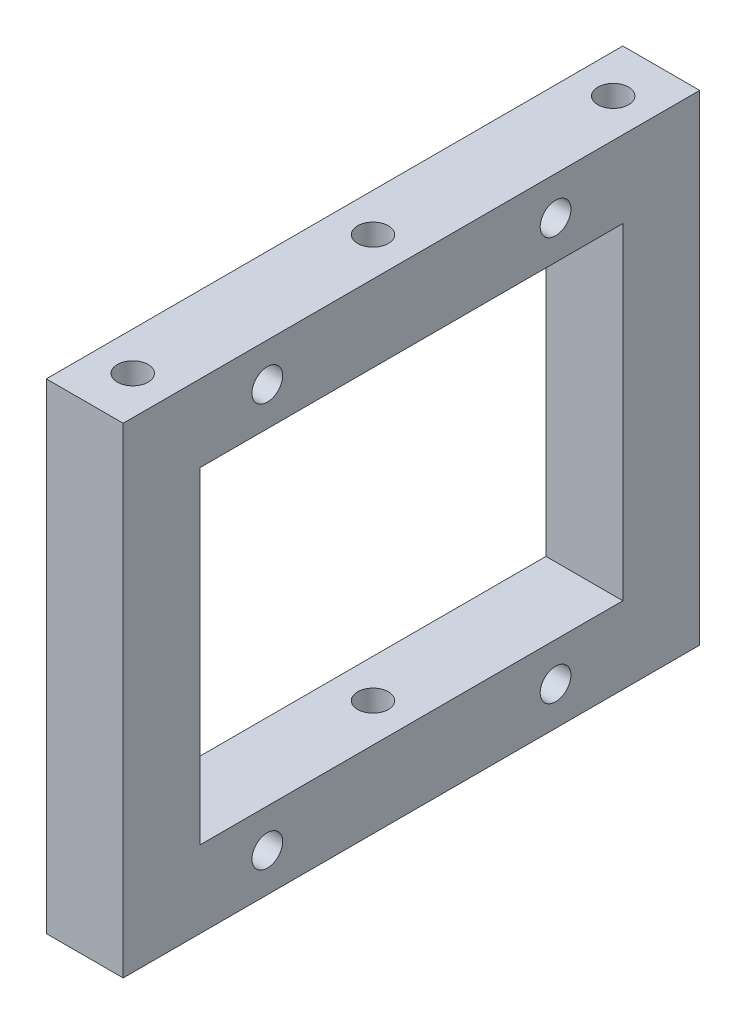
ISO-10303-21;
HEADER;
FILE_DESCRIPTION(('STEP AP214'),'2;1');
FILE_NAME('part.step','',(''),(''),'','','');
FILE_SCHEMA(('AUTOMOTIVE_DESIGN { 1 0 10303 214 1 1 1 1 }'));
ENDSEC;
DATA;
#1=APPLICATION_CONTEXT('core data for automotive mechanical design processes');
#2=APPLICATION_PROTOCOL_DEFINITION('international standard','automotive_design',2000,#1);
#3=PRODUCT_CONTEXT('',#1,'mechanical');
#4=PRODUCT('Part','Part','',(#3));
#5=PRODUCT_RELATED_PRODUCT_CATEGORY('part','',(#4));
#6=PRODUCT_DEFINITION_FORMATION('','',#4);
#7=PRODUCT_DEFINITION_CONTEXT('part definition',#1,'design');
#8=PRODUCT_DEFINITION('design','',#6,#7);
#9=PRODUCT_DEFINITION_SHAPE('','',#8);
#10=(LENGTH_UNIT() NAMED_UNIT(*) SI_UNIT(.MILLI.,.METRE.));
#11=(NAMED_UNIT(*) PLANE_ANGLE_UNIT() SI_UNIT($,.RADIAN.));
#12=(NAMED_UNIT(*) SI_UNIT($,.STERADIAN.) SOLID_ANGLE_UNIT());
#13=UNCERTAINTY_MEASURE_WITH_UNIT(LENGTH_MEASURE(1.E-05),#10,'distance_accuracy_value','');
#14=(GEOMETRIC_REPRESENTATION_CONTEXT(3) GLOBAL_UNCERTAINTY_ASSIGNED_CONTEXT((#13)) GLOBAL_UNIT_ASSIGNED_CONTEXT((#10,
#11,#12)) REPRESENTATION_CONTEXT('',''));
#15=CARTESIAN_POINT('',(0.,0.,0.));
#16=DIRECTION('',(0.,0.,1.));
#17=DIRECTION('',(1.,0.,0.));
#18=AXIS2_PLACEMENT_3D('',#15,#16,#17);
#19=CARTESIAN_POINT('',(8.,0.,0.));
#20=DIRECTION('',(-1.,0.,0.));
#21=DIRECTION('',(0.,0.,1.));
#22=AXIS2_PLACEMENT_3D('',#19,#20,#21);
#23=PLANE('',#22);
#24=CARTESIAN_POINT('',(8.,4.,-15.));
#25=DIRECTION('',(1.,0.,0.));
#26=DIRECTION('',(0.,0.,-1.));
#27=AXIS2_PLACEMENT_3D('',#24,#25,#26);
#28=CIRCLE('',#27,1.6);
#29=CARTESIAN_POINT('',(8.,4.,-16.6));
#30=VERTEX_POINT('',#29);
#31=EDGE_CURVE('E146',#30,#30,#28,.T.);
#32=ORIENTED_EDGE('',*,*,#31,.F.);
#33=EDGE_LOOP('',(#32));
#34=FACE_BOUND('',#33,.T.);
#35=CARTESIAN_POINT('',(8.,46.,-45.));
#36=DIRECTION('',(1.,0.,0.));
#37=DIRECTION('',(0.,0.,-1.));
#38=AXIS2_PLACEMENT_3D('',#35,#36,#37);
#39=CIRCLE('',#38,1.6);
#40=CARTESIAN_POINT('',(8.,46.,-46.6));
#41=VERTEX_POINT('',#40);
#42=EDGE_CURVE('E152',#41,#41,#39,.T.);
#43=ORIENTED_EDGE('',*,*,#42,.F.);
#44=EDGE_LOOP('',(#43));
#45=FACE_BOUND('',#44,.T.);
#46=CARTESIAN_POINT('',(8.,46.,-15.));
#47=DIRECTION('',(1.,0.,0.));
#48=DIRECTION('',(0.,0.,-1.));
#49=AXIS2_PLACEMENT_3D('',#46,#47,#48);
#50=CIRCLE('',#49,1.6);
#51=CARTESIAN_POINT('',(8.,46.,-16.6));
#52=VERTEX_POINT('',#51);
#53=EDGE_CURVE('E158',#52,#52,#50,.T.);
#54=ORIENTED_EDGE('',*,*,#53,.F.);
#55=EDGE_LOOP('',(#54));
#56=FACE_BOUND('',#55,.T.);
#57=DIRECTION('',(0.,-1.,0.));
#58=VECTOR('',#57,1.);
#59=CARTESIAN_POINT('',(8.,0.,0.));
#60=LINE('',#59,#58);
#61=CARTESIAN_POINT('',(8.,50.,0.));
#62=VERTEX_POINT('',#61);
#63=CARTESIAN_POINT('',(8.,0.,0.));
#64=VERTEX_POINT('',#63);
#65=EDGE_CURVE('E164',#62,#64,#60,.T.);
#66=ORIENTED_EDGE('',*,*,#65,.T.);
#67=DIRECTION('',(0.,0.,-1.));
#68=VECTOR('',#67,1.);
#69=CARTESIAN_POINT('',(8.,0.,0.));
#70=LINE('',#69,#68);
#71=CARTESIAN_POINT('',(8.,0.,-60.));
#72=VERTEX_POINT('',#71);
#73=EDGE_CURVE('E167',#64,#72,#70,.T.);
#74=ORIENTED_EDGE('',*,*,#73,.T.);
#75=DIRECTION('',(0.,1.,0.));
#76=VECTOR('',#75,1.);
#77=CARTESIAN_POINT('',(8.,0.,-60.));
#78=LINE('',#77,#76);
#79=CARTESIAN_POINT('',(8.,50.,-60.));
#80=VERTEX_POINT('',#79);
#81=EDGE_CURVE('E170',#72,#80,#78,.T.);
#82=ORIENTED_EDGE('',*,*,#81,.T.);
#83=DIRECTION('',(0.,0.,1.));
#84=VECTOR('',#83,1.);
#85=CARTESIAN_POINT('',(8.,50.,0.));
#86=LINE('',#85,#84);
#87=EDGE_CURVE('E172',#80,#62,#86,.T.);
#88=ORIENTED_EDGE('',*,*,#87,.T.);
#89=EDGE_LOOP('',(#66,#74,#82,#88));
#90=FACE_BOUND('',#89,.T.);
#91=DIRECTION('',(0.,-1.,0.));
#92=VECTOR('',#91,1.);
#93=CARTESIAN_POINT('',(8.,42.,-8.));
#94=LINE('',#93,#92);
#95=CARTESIAN_POINT('',(8.,42.,-8.));
#96=VERTEX_POINT('',#95);
#97=CARTESIAN_POINT('',(8.,8.00000000000001,-8.));
#98=VERTEX_POINT('',#97);
#99=EDGE_CURVE('E107',#96,#98,#94,.T.);
#100=ORIENTED_EDGE('',*,*,#99,.F.);
#101=DIRECTION('',(0.,0.,1.));
#102=VECTOR('',#101,1.);
#103=CARTESIAN_POINT('',(8.,42.,-8.));
#104=LINE('',#103,#102);
#105=CARTESIAN_POINT('',(8.,42.,-52.));
#106=VERTEX_POINT('',#105);
#107=EDGE_CURVE('E130',#106,#96,#104,.T.);
#108=ORIENTED_EDGE('',*,*,#107,.F.);
#109=DIRECTION('',(0.,1.,0.));
#110=VECTOR('',#109,1.);
#111=CARTESIAN_POINT('',(8.,42.,-52.));
#112=LINE('',#111,#110);
#113=CARTESIAN_POINT('',(8.,8.00000000000001,-52.));
#114=VERTEX_POINT('',#113);
#115=EDGE_CURVE('E128',#114,#106,#112,.T.);
#116=ORIENTED_EDGE('',*,*,#115,.F.);
#117=DIRECTION('',(0.,0.,-1.));
#118=VECTOR('',#117,1.);
#119=CARTESIAN_POINT('',(8.,8.00000000000001,-8.));
#120=LINE('',#119,#118);
#121=EDGE_CURVE('E115',#98,#114,#120,.T.);
#122=ORIENTED_EDGE('',*,*,#121,.F.);
#123=EDGE_LOOP('',(#100,#108,#116,#122));
#124=FACE_BOUND('',#123,.T.);
#125=CARTESIAN_POINT('',(8.,4.,-45.));
#126=DIRECTION('',(1.,0.,0.));
#127=DIRECTION('',(0.,0.,-1.));
#128=AXIS2_PLACEMENT_3D('',#125,#126,#127);
#129=CIRCLE('',#128,1.6);
#130=CARTESIAN_POINT('',(8.,4.,-46.6));
#131=VERTEX_POINT('',#130);
#132=EDGE_CURVE('E136',#131,#131,#129,.T.);
#133=ORIENTED_EDGE('',*,*,#132,.F.);
#134=EDGE_LOOP('',(#133));
#135=FACE_BOUND('',#134,.T.);
#136=ADVANCED_FACE('F40',(#34,#45,#56,#90,#124,#135),#23,.F.);
#137=CARTESIAN_POINT('',(0.,0.,0.));
#138=DIRECTION('',(-1.,0.,0.));
#139=DIRECTION('',(0.,0.,1.));
#140=AXIS2_PLACEMENT_3D('',#137,#138,#139);
#141=PLANE('',#140);
#142=DIRECTION('',(0.,0.,1.));
#143=VECTOR('',#142,1.);
#144=CARTESIAN_POINT('',(0.,42.,-8.));
#145=LINE('',#144,#143);
#146=CARTESIAN_POINT('',(0.,42.,-52.));
#147=VERTEX_POINT('',#146);
#148=CARTESIAN_POINT('',(0.,42.,-8.));
#149=VERTEX_POINT('',#148);
#150=EDGE_CURVE('E116',#147,#149,#145,.T.);
#151=ORIENTED_EDGE('',*,*,#150,.T.);
#152=DIRECTION('',(0.,-1.,0.));
#153=VECTOR('',#152,1.);
#154=CARTESIAN_POINT('',(0.,42.,-8.));
#155=LINE('',#154,#153);
#156=CARTESIAN_POINT('',(0.,8.00000000000001,-8.));
#157=VERTEX_POINT('',#156);
#158=EDGE_CURVE('E65',#149,#157,#155,.T.);
#159=ORIENTED_EDGE('',*,*,#158,.T.);
#160=DIRECTION('',(0.,0.,-1.));
#161=VECTOR('',#160,1.);
#162=CARTESIAN_POINT('',(0.,8.00000000000001,-8.));
#163=LINE('',#162,#161);
#164=CARTESIAN_POINT('',(0.,8.00000000000001,-52.));
#165=VERTEX_POINT('',#164);
#166=EDGE_CURVE('E122',#157,#165,#163,.T.);
#167=ORIENTED_EDGE('',*,*,#166,.T.);
#168=DIRECTION('',(0.,1.,0.));
#169=VECTOR('',#168,1.);
#170=CARTESIAN_POINT('',(0.,42.,-52.));
#171=LINE('',#170,#169);
#172=EDGE_CURVE('E138',#165,#147,#171,.T.);
#173=ORIENTED_EDGE('',*,*,#172,.T.);
#174=EDGE_LOOP('',(#151,#159,#167,#173));
#175=FACE_BOUND('',#174,.T.);
#176=CARTESIAN_POINT('',(0.,4.,-15.));
#177=DIRECTION('',(1.,0.,0.));
#178=DIRECTION('',(0.,0.,-1.));
#179=AXIS2_PLACEMENT_3D('',#176,#177,#178);
#180=CIRCLE('',#179,1.6);
#181=CARTESIAN_POINT('',(0.,4.,-16.6));
#182=VERTEX_POINT('',#181);
#183=EDGE_CURVE('E123',#182,#182,#180,.T.);
#184=ORIENTED_EDGE('',*,*,#183,.T.);
#185=EDGE_LOOP('',(#184));
#186=FACE_BOUND('',#185,.T.);
#187=CARTESIAN_POINT('',(0.,46.,-15.));
#188=DIRECTION('',(1.,0.,0.));
#189=DIRECTION('',(0.,0.,-1.));
#190=AXIS2_PLACEMENT_3D('',#187,#188,#189);
#191=CIRCLE('',#190,1.6);
#192=CARTESIAN_POINT('',(0.,46.,-16.6));
#193=VERTEX_POINT('',#192);
#194=EDGE_CURVE('E155',#193,#193,#191,.T.);
#195=ORIENTED_EDGE('',*,*,#194,.T.);
#196=EDGE_LOOP('',(#195));
#197=FACE_BOUND('',#196,.T.);
#198=DIRECTION('',(0.,-1.,0.));
#199=VECTOR('',#198,1.);
#200=CARTESIAN_POINT('',(0.,0.,0.));
#201=LINE('',#200,#199);
#202=CARTESIAN_POINT('',(0.,50.,0.));
#203=VERTEX_POINT('',#202);
#204=CARTESIAN_POINT('',(0.,0.,0.));
#205=VERTEX_POINT('',#204);
#206=EDGE_CURVE('E161',#203,#205,#201,.T.);
#207=ORIENTED_EDGE('',*,*,#206,.F.);
#208=DIRECTION('',(0.,0.,1.));
#209=VECTOR('',#208,1.);
#210=CARTESIAN_POINT('',(0.,50.,0.));
#211=LINE('',#210,#209);
#212=CARTESIAN_POINT('',(0.,50.,-60.));
#213=VERTEX_POINT('',#212);
#214=EDGE_CURVE('E168',#213,#203,#211,.T.);
#215=ORIENTED_EDGE('',*,*,#214,.F.);
#216=DIRECTION('',(0.,1.,0.));
#217=VECTOR('',#216,1.);
#218=CARTESIAN_POINT('',(0.,0.,-60.));
#219=LINE('',#218,#217);
#220=CARTESIAN_POINT('',(0.,0.,-60.));
#221=VERTEX_POINT('',#220);
#222=EDGE_CURVE('E179',#221,#213,#219,.T.);
#223=ORIENTED_EDGE('',*,*,#222,.F.);
#224=DIRECTION('',(0.,0.,-1.));
#225=VECTOR('',#224,1.);
#226=CARTESIAN_POINT('',(0.,0.,0.));
#227=LINE('',#226,#225);
#228=EDGE_CURVE('E177',#205,#221,#227,.T.);
#229=ORIENTED_EDGE('',*,*,#228,.F.);
#230=EDGE_LOOP('',(#207,#215,#223,#229));
#231=FACE_BOUND('',#230,.T.);
#232=CARTESIAN_POINT('',(0.,46.,-45.));
#233=DIRECTION('',(1.,0.,0.));
#234=DIRECTION('',(0.,0.,-1.));
#235=AXIS2_PLACEMENT_3D('',#232,#233,#234);
#236=CIRCLE('',#235,1.6);
#237=CARTESIAN_POINT('',(0.,46.,-46.6));
#238=VERTEX_POINT('',#237);
#239=EDGE_CURVE('E149',#238,#238,#236,.T.);
#240=ORIENTED_EDGE('',*,*,#239,.T.);
#241=EDGE_LOOP('',(#240));
#242=FACE_BOUND('',#241,.T.);
#243=CARTESIAN_POINT('',(0.,4.,-45.));
#244=DIRECTION('',(1.,0.,0.));
#245=DIRECTION('',(0.,0.,-1.));
#246=AXIS2_PLACEMENT_3D('',#243,#244,#245);
#247=CIRCLE('',#246,1.6);
#248=CARTESIAN_POINT('',(0.,4.,-46.6));
#249=VERTEX_POINT('',#248);
#250=EDGE_CURVE('E190',#249,#249,#247,.T.);
#251=ORIENTED_EDGE('',*,*,#250,.T.);
#252=EDGE_LOOP('',(#251));
#253=FACE_BOUND('',#252,.T.);
#254=ADVANCED_FACE('F221',(#175,#186,#197,#231,#242,#253),#141,.T.);
#255=CARTESIAN_POINT('',(8.,0.,0.));
#256=DIRECTION('',(0.,0.,-1.));
#257=DIRECTION('',(-1.,0.,0.));
#258=AXIS2_PLACEMENT_3D('',#255,#256,#257);
#259=PLANE('',#258);
#260=ORIENTED_EDGE('',*,*,#206,.T.);
#261=DIRECTION('',(-1.,0.,0.));
#262=VECTOR('',#261,1.);
#263=CARTESIAN_POINT('',(8.,0.,0.));
#264=LINE('',#263,#262);
#265=EDGE_CURVE('E11',#64,#205,#264,.T.);
#266=ORIENTED_EDGE('',*,*,#265,.F.);
#267=ORIENTED_EDGE('',*,*,#65,.F.);
#268=DIRECTION('',(-1.,0.,0.));
#269=VECTOR('',#268,1.);
#270=CARTESIAN_POINT('',(8.,50.,0.));
#271=LINE('',#270,#269);
#272=EDGE_CURVE('E174',#62,#203,#271,.T.);
#273=ORIENTED_EDGE('',*,*,#272,.T.);
#274=EDGE_LOOP('',(#260,#266,#267,#273));
#275=FACE_BOUND('',#274,.T.);
#276=ADVANCED_FACE('F42',(#275),#259,.F.);
#277=CARTESIAN_POINT('',(8.,0.,0.));
#278=DIRECTION('',(0.,1.,0.));
#279=DIRECTION('',(0.,0.,1.));
#280=AXIS2_PLACEMENT_3D('',#277,#278,#279);
#281=PLANE('',#280);
#282=CARTESIAN_POINT('',(4.,0.,-5.));
#283=DIRECTION('',(0.,-1.,0.));
#284=DIRECTION('',(0.,0.,-1.));
#285=AXIS2_PLACEMENT_3D('',#282,#283,#284);
#286=CIRCLE('',#285,1.6);
#287=CARTESIAN_POINT('',(4.,0.,-6.6));
#288=VERTEX_POINT('',#287);
#289=EDGE_CURVE('E196',#288,#288,#286,.T.);
#290=ORIENTED_EDGE('',*,*,#289,.F.);
#291=EDGE_LOOP('',(#290));
#292=FACE_BOUND('',#291,.T.);
#293=CARTESIAN_POINT('',(4.,0.,-30.));
#294=DIRECTION('',(0.,-1.,0.));
#295=DIRECTION('',(0.,0.,-1.));
#296=AXIS2_PLACEMENT_3D('',#293,#294,#295);
#297=CIRCLE('',#296,1.6);
#298=CARTESIAN_POINT('',(4.,0.,-31.6));
#299=VERTEX_POINT('',#298);
#300=EDGE_CURVE('E201',#299,#299,#297,.T.);
#301=ORIENTED_EDGE('',*,*,#300,.F.);
#302=EDGE_LOOP('',(#301));
#303=FACE_BOUND('',#302,.T.);
#304=CARTESIAN_POINT('',(4.00000000000001,0.,-55.));
#305=DIRECTION('',(0.,-1.,0.));
#306=DIRECTION('',(0.,0.,-1.));
#307=AXIS2_PLACEMENT_3D('',#304,#305,#306);
#308=CIRCLE('',#307,1.6);
#309=CARTESIAN_POINT('',(4.00000000000001,0.,-56.6));
#310=VERTEX_POINT('',#309);
#311=EDGE_CURVE('E212',#310,#310,#308,.T.);
#312=ORIENTED_EDGE('',*,*,#311,.F.);
#313=EDGE_LOOP('',(#312));
#314=FACE_BOUND('',#313,.T.);
#315=ORIENTED_EDGE('',*,*,#228,.T.);
#316=DIRECTION('',(-1.,0.,0.));
#317=VECTOR('',#316,1.);
#318=CARTESIAN_POINT('',(8.,0.,-60.));
#319=LINE('',#318,#317);
#320=EDGE_CURVE('E49',#72,#221,#319,.T.);
#321=ORIENTED_EDGE('',*,*,#320,.F.);
#322=ORIENTED_EDGE('',*,*,#73,.F.);
#323=ORIENTED_EDGE('',*,*,#265,.T.);
#324=EDGE_LOOP('',(#315,#321,#322,#323));
#325=FACE_BOUND('',#324,.T.);
#326=ADVANCED_FACE('F241',(#292,#303,#314,#325),#281,.F.);
#327=CARTESIAN_POINT('',(8.,0.,-60.));
#328=DIRECTION('',(0.,0.,1.));
#329=DIRECTION('',(1.,0.,0.));
#330=AXIS2_PLACEMENT_3D('',#327,#328,#329);
#331=PLANE('',#330);
#332=ORIENTED_EDGE('',*,*,#222,.T.);
#333=DIRECTION('',(-1.,0.,0.));
#334=VECTOR('',#333,1.);
#335=CARTESIAN_POINT('',(8.,50.,-60.));
#336=LINE('',#335,#334);
#337=EDGE_CURVE('E184',#80,#213,#336,.T.);
#338=ORIENTED_EDGE('',*,*,#337,.F.);
#339=ORIENTED_EDGE('',*,*,#81,.F.);
#340=ORIENTED_EDGE('',*,*,#320,.T.);
#341=EDGE_LOOP('',(#332,#338,#339,#340));
#342=FACE_BOUND('',#341,.T.);
#343=ADVANCED_FACE('F238',(#342),#331,.F.);
#344=CARTESIAN_POINT('',(8.,50.,0.));
#345=DIRECTION('',(0.,-1.,0.));
#346=DIRECTION('',(0.,0.,-1.));
#347=AXIS2_PLACEMENT_3D('',#344,#345,#346);
#348=PLANE('',#347);
#349=CARTESIAN_POINT('',(4.,50.,-5.));
#350=DIRECTION('',(0.,-1.,0.));
#351=DIRECTION('',(0.,0.,-1.));
#352=AXIS2_PLACEMENT_3D('',#349,#350,#351);
#353=CIRCLE('',#352,1.6);
#354=CARTESIAN_POINT('',(4.,50.,-6.6));
#355=VERTEX_POINT('',#354);
#356=EDGE_CURVE('E557',#355,#355,#353,.T.);
#357=ORIENTED_EDGE('',*,*,#356,.T.);
#358=EDGE_LOOP('',(#357));
#359=FACE_BOUND('',#358,.T.);
#360=CARTESIAN_POINT('',(4.,50.,-30.));
#361=DIRECTION('',(0.,-1.,0.));
#362=DIRECTION('',(0.,0.,-1.));
#363=AXIS2_PLACEMENT_3D('',#360,#361,#362);
#364=CIRCLE('',#363,1.6);
#365=CARTESIAN_POINT('',(4.,50.,-31.6));
#366=VERTEX_POINT('',#365);
#367=EDGE_CURVE('E561',#366,#366,#364,.T.);
#368=ORIENTED_EDGE('',*,*,#367,.T.);
#369=EDGE_LOOP('',(#368));
#370=FACE_BOUND('',#369,.T.);
#371=CARTESIAN_POINT('',(4.00000000000001,50.,-55.));
#372=DIRECTION('',(0.,-1.,0.));
#373=DIRECTION('',(0.,0.,-1.));
#374=AXIS2_PLACEMENT_3D('',#371,#372,#373);
#375=CIRCLE('',#374,1.6);
#376=CARTESIAN_POINT('',(4.00000000000001,50.,-56.6));
#377=VERTEX_POINT('',#376);
#378=EDGE_CURVE('E204',#377,#377,#375,.T.);
#379=ORIENTED_EDGE('',*,*,#378,.T.);
#380=EDGE_LOOP('',(#379));
#381=FACE_BOUND('',#380,.T.);
#382=ORIENTED_EDGE('',*,*,#214,.T.);
#383=ORIENTED_EDGE('',*,*,#272,.F.);
#384=ORIENTED_EDGE('',*,*,#87,.F.);
#385=ORIENTED_EDGE('',*,*,#337,.T.);
#386=EDGE_LOOP('',(#382,#383,#384,#385));
#387=FACE_BOUND('',#386,.T.);
#388=ADVANCED_FACE('F235',(#359,#370,#381,#387),#348,.F.);
#389=CARTESIAN_POINT('',(8.,46.,-15.));
#390=DIRECTION('',(-1.,0.,0.));
#391=DIRECTION('',(0.,0.,1.));
#392=AXIS2_PLACEMENT_3D('',#389,#390,#391);
#393=CYLINDRICAL_SURFACE('',#392,1.6);
#394=ORIENTED_EDGE('',*,*,#53,.T.);
#395=EDGE_LOOP('',(#394));
#396=FACE_BOUND('',#395,.T.);
#397=ORIENTED_EDGE('',*,*,#194,.F.);
#398=EDGE_LOOP('',(#397));
#399=FACE_BOUND('',#398,.T.);
#400=ADVANCED_FACE('F232',(#396,#399),#393,.F.);
#401=CARTESIAN_POINT('',(8.,46.,-45.));
#402=DIRECTION('',(-1.,0.,0.));
#403=DIRECTION('',(0.,0.,1.));
#404=AXIS2_PLACEMENT_3D('',#401,#402,#403);
#405=CYLINDRICAL_SURFACE('',#404,1.6);
#406=ORIENTED_EDGE('',*,*,#42,.T.);
#407=EDGE_LOOP('',(#406));
#408=FACE_BOUND('',#407,.T.);
#409=ORIENTED_EDGE('',*,*,#239,.F.);
#410=EDGE_LOOP('',(#409));
#411=FACE_BOUND('',#410,.T.);
#412=ADVANCED_FACE('F298',(#408,#411),#405,.F.);
#413=CARTESIAN_POINT('',(8.,4.,-15.));
#414=DIRECTION('',(-1.,0.,0.));
#415=DIRECTION('',(0.,0.,1.));
#416=AXIS2_PLACEMENT_3D('',#413,#414,#415);
#417=CYLINDRICAL_SURFACE('',#416,1.6);
#418=ORIENTED_EDGE('',*,*,#31,.T.);
#419=EDGE_LOOP('',(#418));
#420=FACE_BOUND('',#419,.T.);
#421=ORIENTED_EDGE('',*,*,#183,.F.);
#422=EDGE_LOOP('',(#421));
#423=FACE_BOUND('',#422,.T.);
#424=ADVANCED_FACE('F296',(#420,#423),#417,.F.);
#425=CARTESIAN_POINT('',(8.,42.,-8.));
#426=DIRECTION('',(0.,0.,-1.));
#427=DIRECTION('',(-1.,0.,0.));
#428=AXIS2_PLACEMENT_3D('',#425,#426,#427);
#429=PLANE('',#428);
#430=ORIENTED_EDGE('',*,*,#158,.F.);
#431=DIRECTION('',(-1.,0.,0.));
#432=VECTOR('',#431,1.);
#433=CARTESIAN_POINT('',(8.,42.,-8.));
#434=LINE('',#433,#432);
#435=EDGE_CURVE('E111',#96,#149,#434,.T.);
#436=ORIENTED_EDGE('',*,*,#435,.F.);
#437=ORIENTED_EDGE('',*,*,#99,.T.);
#438=DIRECTION('',(-1.,0.,0.));
#439=VECTOR('',#438,1.);
#440=CARTESIAN_POINT('',(8.,8.00000000000001,-8.));
#441=LINE('',#440,#439);
#442=EDGE_CURVE('E110',#98,#157,#441,.T.);
#443=ORIENTED_EDGE('',*,*,#442,.T.);
#444=EDGE_LOOP('',(#430,#436,#437,#443));
#445=FACE_BOUND('',#444,.T.);
#446=ADVANCED_FACE('F109',(#445),#429,.T.);
#447=CARTESIAN_POINT('',(8.,8.00000000000001,-8.));
#448=DIRECTION('',(0.,1.,0.));
#449=DIRECTION('',(0.,0.,1.));
#450=AXIS2_PLACEMENT_3D('',#447,#448,#449);
#451=PLANE('',#450);
#452=CARTESIAN_POINT('',(4.,8.00000000000001,-30.));
#453=DIRECTION('',(0.,1.,0.));
#454=DIRECTION('',(0.,0.,1.));
#455=AXIS2_PLACEMENT_3D('',#452,#453,#454);
#456=CIRCLE('',#455,1.6);
#457=CARTESIAN_POINT('',(4.,8.00000000000001,-28.4));
#458=VERTEX_POINT('',#457);
#459=EDGE_CURVE('E188',#458,#458,#456,.T.);
#460=ORIENTED_EDGE('',*,*,#459,.F.);
#461=EDGE_LOOP('',(#460));
#462=FACE_BOUND('',#461,.T.);
#463=ORIENTED_EDGE('',*,*,#166,.F.);
#464=ORIENTED_EDGE('',*,*,#442,.F.);
#465=ORIENTED_EDGE('',*,*,#121,.T.);
#466=DIRECTION('',(-1.,0.,0.));
#467=VECTOR('',#466,1.);
#468=CARTESIAN_POINT('',(8.,8.00000000000001,-52.));
#469=LINE('',#468,#467);
#470=EDGE_CURVE('E124',#114,#165,#469,.T.);
#471=ORIENTED_EDGE('',*,*,#470,.T.);
#472=EDGE_LOOP('',(#463,#464,#465,#471));
#473=FACE_BOUND('',#472,.T.);
#474=ADVANCED_FACE('F119',(#462,#473),#451,.T.);
#475=CARTESIAN_POINT('',(8.,42.,-52.));
#476=DIRECTION('',(0.,0.,1.));
#477=DIRECTION('',(1.,0.,0.));
#478=AXIS2_PLACEMENT_3D('',#475,#476,#477);
#479=PLANE('',#478);
#480=ORIENTED_EDGE('',*,*,#172,.F.);
#481=ORIENTED_EDGE('',*,*,#470,.F.);
#482=ORIENTED_EDGE('',*,*,#115,.T.);
#483=DIRECTION('',(-1.,0.,0.));
#484=VECTOR('',#483,1.);
#485=CARTESIAN_POINT('',(8.,42.,-52.));
#486=LINE('',#485,#484);
#487=EDGE_CURVE('E57',#106,#147,#486,.T.);
#488=ORIENTED_EDGE('',*,*,#487,.T.);
#489=EDGE_LOOP('',(#480,#481,#482,#488));
#490=FACE_BOUND('',#489,.T.);
#491=ADVANCED_FACE('F282',(#490),#479,.T.);
#492=CARTESIAN_POINT('',(8.,42.,-8.));
#493=DIRECTION('',(0.,-1.,0.));
#494=DIRECTION('',(0.,0.,-1.));
#495=AXIS2_PLACEMENT_3D('',#492,#493,#494);
#496=PLANE('',#495);
#497=CARTESIAN_POINT('',(4.,42.,-30.));
#498=DIRECTION('',(0.,-1.,0.));
#499=DIRECTION('',(0.,0.,-1.));
#500=AXIS2_PLACEMENT_3D('',#497,#498,#499);
#501=CIRCLE('',#500,1.6);
#502=CARTESIAN_POINT('',(4.,42.,-31.6));
#503=VERTEX_POINT('',#502);
#504=EDGE_CURVE('E44',#503,#503,#501,.F.);
#505=ORIENTED_EDGE('',*,*,#504,.T.);
#506=EDGE_LOOP('',(#505));
#507=FACE_BOUND('',#506,.T.);
#508=ORIENTED_EDGE('',*,*,#150,.F.);
#509=ORIENTED_EDGE('',*,*,#487,.F.);
#510=ORIENTED_EDGE('',*,*,#107,.T.);
#511=ORIENTED_EDGE('',*,*,#435,.T.);
#512=EDGE_LOOP('',(#508,#509,#510,#511));
#513=FACE_BOUND('',#512,.T.);
#514=ADVANCED_FACE('F274',(#507,#513),#496,.T.);
#515=CARTESIAN_POINT('',(8.,4.,-45.));
#516=DIRECTION('',(-1.,0.,0.));
#517=DIRECTION('',(0.,0.,1.));
#518=AXIS2_PLACEMENT_3D('',#515,#516,#517);
#519=CYLINDRICAL_SURFACE('',#518,1.6);
#520=ORIENTED_EDGE('',*,*,#132,.T.);
#521=EDGE_LOOP('',(#520));
#522=FACE_BOUND('',#521,.T.);
#523=ORIENTED_EDGE('',*,*,#250,.F.);
#524=EDGE_LOOP('',(#523));
#525=FACE_BOUND('',#524,.T.);
#526=ADVANCED_FACE('F218',(#522,#525),#519,.F.);
#527=CARTESIAN_POINT('',(4.,10.,-30.));
#528=DIRECTION('',(0.,-1.,0.));
#529=DIRECTION('',(0.,0.,-1.));
#530=AXIS2_PLACEMENT_3D('',#527,#528,#529);
#531=CYLINDRICAL_SURFACE('',#530,1.6);
#532=ORIENTED_EDGE('',*,*,#459,.T.);
#533=EDGE_LOOP('',(#532));
#534=FACE_BOUND('',#533,.T.);
#535=ORIENTED_EDGE('',*,*,#300,.T.);
#536=EDGE_LOOP('',(#535));
#537=FACE_BOUND('',#536,.T.);
#538=ADVANCED_FACE('F273',(#534,#537),#531,.F.);
#539=CARTESIAN_POINT('',(4.00000000000001,10.,-55.));
#540=DIRECTION('',(0.,-1.,0.));
#541=DIRECTION('',(0.,0.,-1.));
#542=AXIS2_PLACEMENT_3D('',#539,#540,#541);
#543=CYLINDRICAL_SURFACE('',#542,1.6);
#544=CARTESIAN_POINT('',(4.00000000000001,10.,-55.));
#545=DIRECTION('',(0.,-1.,0.));
#546=DIRECTION('',(0.,0.,-1.));
#547=AXIS2_PLACEMENT_3D('',#544,#545,#546);
#548=CIRCLE('',#547,1.6);
#549=CARTESIAN_POINT('',(4.00000000000001,10.,-56.6));
#550=VERTEX_POINT('',#549);
#551=EDGE_CURVE('E209',#550,#550,#548,.T.);
#552=ORIENTED_EDGE('',*,*,#551,.F.);
#553=EDGE_LOOP('',(#552));
#554=FACE_BOUND('',#553,.T.);
#555=ORIENTED_EDGE('',*,*,#311,.T.);
#556=EDGE_LOOP('',(#555));
#557=FACE_BOUND('',#556,.T.);
#558=ADVANCED_FACE('F280',(#554,#557),#543,.F.);
#559=CARTESIAN_POINT('',(4.00000000000001,10.,-55.));
#560=DIRECTION('',(0.,-1.,0.));
#561=DIRECTION('',(0.,0.,-1.));
#562=AXIS2_PLACEMENT_3D('',#559,#560,#561);
#563=PLANE('',#562);
#564=ORIENTED_EDGE('',*,*,#551,.T.);
#565=EDGE_LOOP('',(#564));
#566=FACE_BOUND('',#565,.T.);
#567=ADVANCED_FACE('F410',(#566),#563,.T.);
#568=CARTESIAN_POINT('',(4.,10.,-5.));
#569=DIRECTION('',(0.,-1.,0.));
#570=DIRECTION('',(0.,0.,-1.));
#571=AXIS2_PLACEMENT_3D('',#568,#569,#570);
#572=CYLINDRICAL_SURFACE('',#571,1.6);
#573=CARTESIAN_POINT('',(4.,10.,-5.));
#574=DIRECTION('',(0.,-1.,0.));
#575=DIRECTION('',(0.,0.,-1.));
#576=AXIS2_PLACEMENT_3D('',#573,#574,#575);
#577=CIRCLE('',#576,1.6);
#578=CARTESIAN_POINT('',(4.,10.,-6.6));
#579=VERTEX_POINT('',#578);
#580=EDGE_CURVE('E191',#579,#579,#577,.T.);
#581=ORIENTED_EDGE('',*,*,#580,.F.);
#582=EDGE_LOOP('',(#581));
#583=FACE_BOUND('',#582,.T.);
#584=ORIENTED_EDGE('',*,*,#289,.T.);
#585=EDGE_LOOP('',(#584));
#586=FACE_BOUND('',#585,.T.);
#587=ADVANCED_FACE('F420',(#583,#586),#572,.F.);
#588=CARTESIAN_POINT('',(4.,10.,-5.));
#589=DIRECTION('',(0.,-1.,0.));
#590=DIRECTION('',(0.,0.,-1.));
#591=AXIS2_PLACEMENT_3D('',#588,#589,#590);
#592=PLANE('',#591);
#593=ORIENTED_EDGE('',*,*,#580,.T.);
#594=EDGE_LOOP('',(#593));
#595=FACE_BOUND('',#594,.T.);
#596=ADVANCED_FACE('F429',(#595),#592,.T.);
#597=CARTESIAN_POINT('',(4.,40.,-30.));
#598=DIRECTION('',(0.,1.,0.));
#599=DIRECTION('',(0.,0.,1.));
#600=AXIS2_PLACEMENT_3D('',#597,#598,#599);
#601=CYLINDRICAL_SURFACE('',#600,1.6);
#602=ORIENTED_EDGE('',*,*,#504,.F.);
#603=EDGE_LOOP('',(#602));
#604=FACE_BOUND('',#603,.T.);
#605=ORIENTED_EDGE('',*,*,#367,.F.);
#606=EDGE_LOOP('',(#605));
#607=FACE_BOUND('',#606,.T.);
#608=ADVANCED_FACE('F440',(#604,#607),#601,.F.);
#609=CARTESIAN_POINT('',(4.00000000000001,40.,-55.));
#610=DIRECTION('',(0.,1.,0.));
#611=DIRECTION('',(0.,0.,1.));
#612=AXIS2_PLACEMENT_3D('',#609,#610,#611);
#613=CYLINDRICAL_SURFACE('',#612,1.6);
#614=CARTESIAN_POINT('',(4.00000000000001,40.,-55.));
#615=DIRECTION('',(0.,-1.,0.));
#616=DIRECTION('',(0.,0.,-1.));
#617=AXIS2_PLACEMENT_3D('',#614,#615,#616);
#618=CIRCLE('',#617,1.6);
#619=CARTESIAN_POINT('',(4.00000000000001,40.,-56.6));
#620=VERTEX_POINT('',#619);
#621=EDGE_CURVE('E565',#620,#620,#618,.T.);
#622=ORIENTED_EDGE('',*,*,#621,.T.);
#623=EDGE_LOOP('',(#622));
#624=FACE_BOUND('',#623,.T.);
#625=ORIENTED_EDGE('',*,*,#378,.F.);
#626=EDGE_LOOP('',(#625));
#627=FACE_BOUND('',#626,.T.);
#628=ADVANCED_FACE('F462',(#624,#627),#613,.F.);
#629=CARTESIAN_POINT('',(4.00000000000001,40.,-55.));
#630=DIRECTION('',(0.,-1.,0.));
#631=DIRECTION('',(0.,0.,-1.));
#632=AXIS2_PLACEMENT_3D('',#629,#630,#631);
#633=PLANE('',#632);
#634=ORIENTED_EDGE('',*,*,#621,.F.);
#635=EDGE_LOOP('',(#634));
#636=FACE_BOUND('',#635,.T.);
#637=ADVANCED_FACE('F473',(#636),#633,.F.);
#638=CARTESIAN_POINT('',(4.,40.,-5.));
#639=DIRECTION('',(0.,1.,0.));
#640=DIRECTION('',(0.,0.,1.));
#641=AXIS2_PLACEMENT_3D('',#638,#639,#640);
#642=CYLINDRICAL_SURFACE('',#641,1.6);
#643=CARTESIAN_POINT('',(4.,40.,-5.));
#644=DIRECTION('',(0.,-1.,0.));
#645=DIRECTION('',(0.,0.,-1.));
#646=AXIS2_PLACEMENT_3D('',#643,#644,#645);
#647=CIRCLE('',#646,1.6);
#648=CARTESIAN_POINT('',(4.,40.,-6.6));
#649=VERTEX_POINT('',#648);
#650=EDGE_CURVE('E556',#649,#649,#647,.T.);
#651=ORIENTED_EDGE('',*,*,#650,.T.);
#652=EDGE_LOOP('',(#651));
#653=FACE_BOUND('',#652,.T.);
#654=ORIENTED_EDGE('',*,*,#356,.F.);
#655=EDGE_LOOP('',(#654));
#656=FACE_BOUND('',#655,.T.);
#657=ADVANCED_FACE('F484',(#653,#656),#642,.F.);
#658=CARTESIAN_POINT('',(4.,40.,-5.));
#659=DIRECTION('',(0.,-1.,0.));
#660=DIRECTION('',(0.,0.,-1.));
#661=AXIS2_PLACEMENT_3D('',#658,#659,#660);
#662=PLANE('',#661);
#663=ORIENTED_EDGE('',*,*,#650,.F.);
#664=EDGE_LOOP('',(#663));
#665=FACE_BOUND('',#664,.T.);
#666=ADVANCED_FACE('F494',(#665),#662,.F.);
#667=CLOSED_SHELL('',(#136,#254,#276,#326,#343,#388,#400,#412,#424,#446,#474,#491,#514,#526,
#538,#558,#567,#587,#596,#608,#628,#637,#657,#666));
#668=MANIFOLD_SOLID_BREP('B2',#667);
#669=ADVANCED_BREP_SHAPE_REPRESENTATION('',(#18,#668),#14);
#670=SHAPE_DEFINITION_REPRESENTATION(#9,#669);
ENDSEC;
END-ISO-10303-21;
